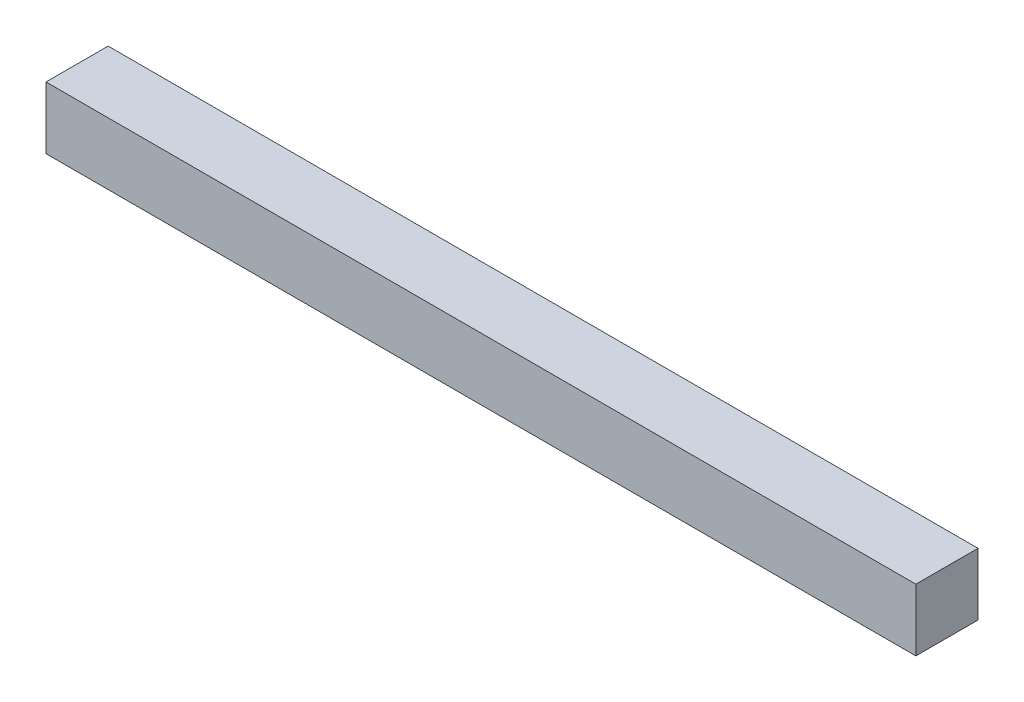
ISO-10303-21;
HEADER;
FILE_DESCRIPTION(('STEP AP214'),'2;1');
FILE_NAME('part.step','',(''),(''),'','','');
FILE_SCHEMA(('AUTOMOTIVE_DESIGN { 1 0 10303 214 1 1 1 1 }'));
ENDSEC;
DATA;
#1=APPLICATION_CONTEXT('core data for automotive mechanical design processes');
#2=APPLICATION_PROTOCOL_DEFINITION('international standard','automotive_design',2000,#1);
#3=PRODUCT_CONTEXT('',#1,'mechanical');
#4=PRODUCT('Part','Part','',(#3));
#5=PRODUCT_RELATED_PRODUCT_CATEGORY('part','',(#4));
#6=PRODUCT_DEFINITION_FORMATION('','',#4);
#7=PRODUCT_DEFINITION_CONTEXT('part definition',#1,'design');
#8=PRODUCT_DEFINITION('design','',#6,#7);
#9=PRODUCT_DEFINITION_SHAPE('','',#8);
#10=(LENGTH_UNIT() NAMED_UNIT(*) SI_UNIT(.MILLI.,.METRE.));
#11=(NAMED_UNIT(*) PLANE_ANGLE_UNIT() SI_UNIT($,.RADIAN.));
#12=(NAMED_UNIT(*) SI_UNIT($,.STERADIAN.) SOLID_ANGLE_UNIT());
#13=UNCERTAINTY_MEASURE_WITH_UNIT(LENGTH_MEASURE(1.E-05),#10,'distance_accuracy_value','');
#14=(GEOMETRIC_REPRESENTATION_CONTEXT(3) GLOBAL_UNCERTAINTY_ASSIGNED_CONTEXT((#13)) GLOBAL_UNIT_ASSIGNED_CONTEXT((#10,
#11,#12)) REPRESENTATION_CONTEXT('',''));
#15=CARTESIAN_POINT('',(0.,0.,0.));
#16=DIRECTION('',(0.,0.,1.));
#17=DIRECTION('',(1.,0.,0.));
#18=AXIS2_PLACEMENT_3D('',#15,#16,#17);
#19=CARTESIAN_POINT('',(-266.7,38.1,-19.05));
#20=DIRECTION('',(1.,0.,0.));
#21=DIRECTION('',(0.,0.,-1.));
#22=AXIS2_PLACEMENT_3D('',#19,#20,#21);
#23=PLANE('',#22);
#24=DIRECTION('',(0.,0.,1.));
#25=VECTOR('',#24,1.);
#26=CARTESIAN_POINT('',(-266.7,0.,-19.05));
#27=LINE('',#26,#25);
#28=CARTESIAN_POINT('',(-266.7,0.,-19.05));
#29=VERTEX_POINT('',#28);
#30=CARTESIAN_POINT('',(-266.7,0.,19.05));
#31=VERTEX_POINT('',#30);
#32=EDGE_CURVE('E96',#29,#31,#27,.T.);
#33=ORIENTED_EDGE('',*,*,#32,.T.);
#34=DIRECTION('',(0.,-1.,0.));
#35=VECTOR('',#34,1.);
#36=CARTESIAN_POINT('',(-266.7,38.1,19.05));
#37=LINE('',#36,#35);
#38=CARTESIAN_POINT('',(-266.7,38.1,19.05));
#39=VERTEX_POINT('',#38);
#40=EDGE_CURVE('E11',#39,#31,#37,.T.);
#41=ORIENTED_EDGE('',*,*,#40,.F.);
#42=DIRECTION('',(0.,0.,1.));
#43=VECTOR('',#42,1.);
#44=CARTESIAN_POINT('',(-266.7,38.1,-19.05));
#45=LINE('',#44,#43);
#46=CARTESIAN_POINT('',(-266.7,38.1,-19.05));
#47=VERTEX_POINT('',#46);
#48=EDGE_CURVE('E84',#47,#39,#45,.T.);
#49=ORIENTED_EDGE('',*,*,#48,.F.);
#50=DIRECTION('',(0.,-1.,0.));
#51=VECTOR('',#50,1.);
#52=CARTESIAN_POINT('',(-266.7,38.1,-19.05));
#53=LINE('',#52,#51);
#54=EDGE_CURVE('E92',#47,#29,#53,.T.);
#55=ORIENTED_EDGE('',*,*,#54,.T.);
#56=EDGE_LOOP('',(#33,#41,#49,#55));
#57=FACE_BOUND('',#56,.T.);
#58=ADVANCED_FACE('F33',(#57),#23,.F.);
#59=CARTESIAN_POINT('',(-266.7,38.1,19.05));
#60=DIRECTION('',(0.,0.,-1.));
#61=DIRECTION('',(-1.,0.,0.));
#62=AXIS2_PLACEMENT_3D('',#59,#60,#61);
#63=PLANE('',#62);
#64=DIRECTION('',(1.,0.,0.));
#65=VECTOR('',#64,1.);
#66=CARTESIAN_POINT('',(-266.7,0.,19.05));
#67=LINE('',#66,#65);
#68=CARTESIAN_POINT('',(266.7,0.,19.05));
#69=VERTEX_POINT('',#68);
#70=EDGE_CURVE('E88',#31,#69,#67,.T.);
#71=ORIENTED_EDGE('',*,*,#70,.T.);
#72=DIRECTION('',(0.,-1.,0.));
#73=VECTOR('',#72,1.);
#74=CARTESIAN_POINT('',(266.7,38.1,19.05));
#75=LINE('',#74,#73);
#76=CARTESIAN_POINT('',(266.7,38.1,19.05));
#77=VERTEX_POINT('',#76);
#78=EDGE_CURVE('E41',#77,#69,#75,.T.);
#79=ORIENTED_EDGE('',*,*,#78,.F.);
#80=DIRECTION('',(1.,0.,0.));
#81=VECTOR('',#80,1.);
#82=CARTESIAN_POINT('',(-266.7,38.1,19.05));
#83=LINE('',#82,#81);
#84=EDGE_CURVE('E79',#39,#77,#83,.T.);
#85=ORIENTED_EDGE('',*,*,#84,.F.);
#86=ORIENTED_EDGE('',*,*,#40,.T.);
#87=EDGE_LOOP('',(#71,#79,#85,#86));
#88=FACE_BOUND('',#87,.T.);
#89=ADVANCED_FACE('F87',(#88),#63,.F.);
#90=CARTESIAN_POINT('',(266.7,38.1,-19.05));
#91=DIRECTION('',(-1.,0.,0.));
#92=DIRECTION('',(0.,0.,1.));
#93=AXIS2_PLACEMENT_3D('',#90,#91,#92);
#94=PLANE('',#93);
#95=DIRECTION('',(0.,0.,-1.));
#96=VECTOR('',#95,1.);
#97=CARTESIAN_POINT('',(266.7,0.,-19.05));
#98=LINE('',#97,#96);
#99=CARTESIAN_POINT('',(266.7,0.,-19.05));
#100=VERTEX_POINT('',#99);
#101=EDGE_CURVE('E66',#69,#100,#98,.T.);
#102=ORIENTED_EDGE('',*,*,#101,.T.);
#103=DIRECTION('',(0.,-1.,0.));
#104=VECTOR('',#103,1.);
#105=CARTESIAN_POINT('',(266.7,38.1,-19.05));
#106=LINE('',#105,#104);
#107=CARTESIAN_POINT('',(266.7,38.1,-19.05));
#108=VERTEX_POINT('',#107);
#109=EDGE_CURVE('E89',#108,#100,#106,.T.);
#110=ORIENTED_EDGE('',*,*,#109,.F.);
#111=DIRECTION('',(0.,0.,-1.));
#112=VECTOR('',#111,1.);
#113=CARTESIAN_POINT('',(266.7,38.1,-19.05));
#114=LINE('',#113,#112);
#115=EDGE_CURVE('E82',#77,#108,#114,.T.);
#116=ORIENTED_EDGE('',*,*,#115,.F.);
#117=ORIENTED_EDGE('',*,*,#78,.T.);
#118=EDGE_LOOP('',(#102,#110,#116,#117));
#119=FACE_BOUND('',#118,.T.);
#120=ADVANCED_FACE('F90',(#119),#94,.F.);
#121=CARTESIAN_POINT('',(-266.7,38.1,-19.05));
#122=DIRECTION('',(0.,0.,1.));
#123=DIRECTION('',(1.,0.,0.));
#124=AXIS2_PLACEMENT_3D('',#121,#122,#123);
#125=PLANE('',#124);
#126=DIRECTION('',(-1.,0.,0.));
#127=VECTOR('',#126,1.);
#128=CARTESIAN_POINT('',(-266.7,0.,-19.05));
#129=LINE('',#128,#127);
#130=EDGE_CURVE('E72',#100,#29,#129,.T.);
#131=ORIENTED_EDGE('',*,*,#130,.T.);
#132=ORIENTED_EDGE('',*,*,#54,.F.);
#133=DIRECTION('',(-1.,0.,0.));
#134=VECTOR('',#133,1.);
#135=CARTESIAN_POINT('',(-266.7,38.1,-19.05));
#136=LINE('',#135,#134);
#137=EDGE_CURVE('E49',#108,#47,#136,.T.);
#138=ORIENTED_EDGE('',*,*,#137,.F.);
#139=ORIENTED_EDGE('',*,*,#109,.T.);
#140=EDGE_LOOP('',(#131,#132,#138,#139));
#141=FACE_BOUND('',#140,.T.);
#142=ADVANCED_FACE('F103',(#141),#125,.F.);
#143=CARTESIAN_POINT('',(0.,38.1,0.));
#144=DIRECTION('',(0.,1.,0.));
#145=DIRECTION('',(0.,0.,1.));
#146=AXIS2_PLACEMENT_3D('',#143,#144,#145);
#147=PLANE('',#146);
#148=ORIENTED_EDGE('',*,*,#48,.T.);
#149=ORIENTED_EDGE('',*,*,#84,.T.);
#150=ORIENTED_EDGE('',*,*,#115,.T.);
#151=ORIENTED_EDGE('',*,*,#137,.T.);
#152=EDGE_LOOP('',(#148,#149,#150,#151));
#153=FACE_BOUND('',#152,.T.);
#154=ADVANCED_FACE('F80',(#153),#147,.T.);
#155=CARTESIAN_POINT('',(0.,0.,0.));
#156=DIRECTION('',(0.,1.,0.));
#157=DIRECTION('',(0.,0.,1.));
#158=AXIS2_PLACEMENT_3D('',#155,#156,#157);
#159=PLANE('',#158);
#160=ORIENTED_EDGE('',*,*,#32,.F.);
#161=ORIENTED_EDGE('',*,*,#130,.F.);
#162=ORIENTED_EDGE('',*,*,#101,.F.);
#163=ORIENTED_EDGE('',*,*,#70,.F.);
#164=EDGE_LOOP('',(#160,#161,#162,#163));
#165=FACE_BOUND('',#164,.T.);
#166=ADVANCED_FACE('F106',(#165),#159,.F.);
#167=CLOSED_SHELL('',(#58,#89,#120,#142,#154,#166));
#168=MANIFOLD_SOLID_BREP('B2',#167);
#169=ADVANCED_BREP_SHAPE_REPRESENTATION('',(#18,#168),#14);
#170=SHAPE_DEFINITION_REPRESENTATION(#9,#169);
ENDSEC;
END-ISO-10303-21;
